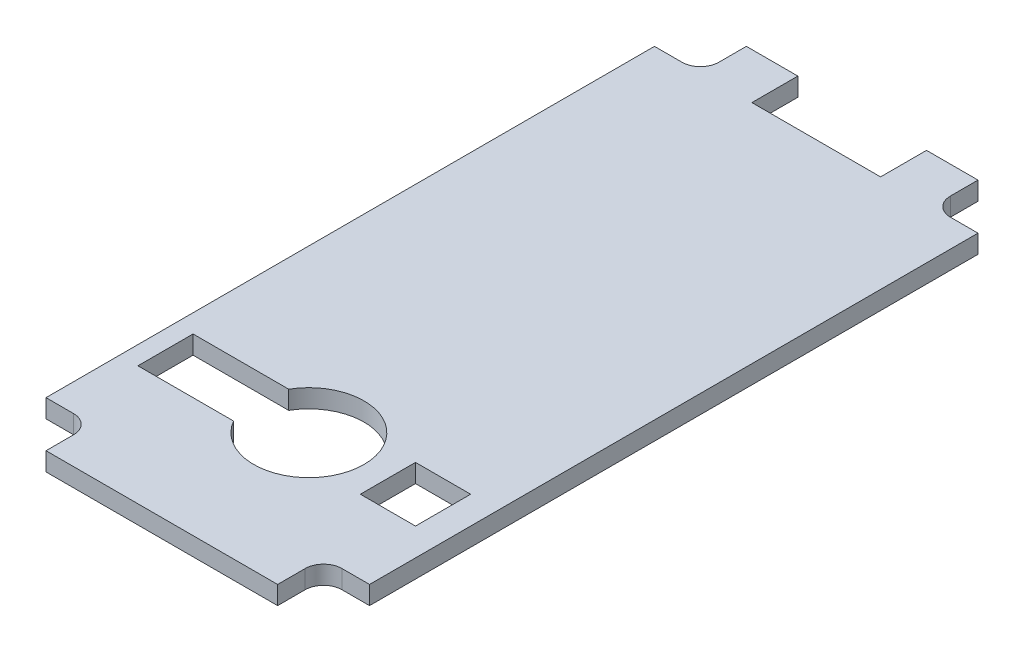
ISO-10303-21;
HEADER;
FILE_DESCRIPTION(('STEP AP214'),'2;1');
FILE_NAME('part.step','',(''),(''),'','','');
FILE_SCHEMA(('AUTOMOTIVE_DESIGN { 1 0 10303 214 1 1 1 1 }'));
ENDSEC;
DATA;
#1=APPLICATION_CONTEXT('core data for automotive mechanical design processes');
#2=APPLICATION_PROTOCOL_DEFINITION('international standard','automotive_design',2000,#1);
#3=PRODUCT_CONTEXT('',#1,'mechanical');
#4=PRODUCT('Part','Part','',(#3));
#5=PRODUCT_RELATED_PRODUCT_CATEGORY('part','',(#4));
#6=PRODUCT_DEFINITION_FORMATION('','',#4);
#7=PRODUCT_DEFINITION_CONTEXT('part definition',#1,'design');
#8=PRODUCT_DEFINITION('design','',#6,#7);
#9=PRODUCT_DEFINITION_SHAPE('','',#8);
#10=(LENGTH_UNIT() NAMED_UNIT(*) SI_UNIT(.MILLI.,.METRE.));
#11=(NAMED_UNIT(*) PLANE_ANGLE_UNIT() SI_UNIT($,.RADIAN.));
#12=(NAMED_UNIT(*) SI_UNIT($,.STERADIAN.) SOLID_ANGLE_UNIT());
#13=UNCERTAINTY_MEASURE_WITH_UNIT(LENGTH_MEASURE(1.E-05),#10,'distance_accuracy_value','');
#14=(GEOMETRIC_REPRESENTATION_CONTEXT(3) GLOBAL_UNCERTAINTY_ASSIGNED_CONTEXT((#13)) GLOBAL_UNIT_ASSIGNED_CONTEXT((#10,
#11,#12)) REPRESENTATION_CONTEXT('',''));
#15=CARTESIAN_POINT('',(0.,0.,0.));
#16=DIRECTION('',(0.,0.,1.));
#17=DIRECTION('',(1.,0.,0.));
#18=AXIS2_PLACEMENT_3D('',#15,#16,#17);
#19=CARTESIAN_POINT('',(-8.8,1.,-19.05));
#20=DIRECTION('',(0.,0.,1.));
#21=DIRECTION('',(1.,0.,0.));
#22=AXIS2_PLACEMENT_3D('',#19,#20,#21);
#23=PLANE('',#22);
#24=DIRECTION('',(-1.,0.,0.));
#25=VECTOR('',#24,1.);
#26=CARTESIAN_POINT('',(-8.8,1.,-19.05));
#27=LINE('',#26,#25);
#28=CARTESIAN_POINT('',(6.3,1.,-19.05));
#29=VERTEX_POINT('',#28);
#30=CARTESIAN_POINT('',(3.5,1.,-19.05));
#31=VERTEX_POINT('',#30);
#32=EDGE_CURVE('E413',#29,#31,#27,.T.);
#33=ORIENTED_EDGE('',*,*,#32,.F.);
#34=DIRECTION('',(0.,1.,0.));
#35=VECTOR('',#34,1.);
#36=CARTESIAN_POINT('',(6.3,-0.000999999999999916,-19.05));
#37=LINE('',#36,#35);
#38=CARTESIAN_POINT('',(6.3,0.,-19.05));
#39=VERTEX_POINT('',#38);
#40=EDGE_CURVE('E375',#39,#29,#37,.T.);
#41=ORIENTED_EDGE('',*,*,#40,.F.);
#42=DIRECTION('',(-1.,0.,0.));
#43=VECTOR('',#42,1.);
#44=CARTESIAN_POINT('',(-8.8,0.,-19.05));
#45=LINE('',#44,#43);
#46=CARTESIAN_POINT('',(3.5,0.,-19.05));
#47=VERTEX_POINT('',#46);
#48=EDGE_CURVE('E419',#39,#47,#45,.T.);
#49=ORIENTED_EDGE('',*,*,#48,.T.);
#50=DIRECTION('',(0.,1.,0.));
#51=VECTOR('',#50,1.);
#52=CARTESIAN_POINT('',(3.5,-0.000999999999999916,-19.05));
#53=LINE('',#52,#51);
#54=EDGE_CURVE('E400',#47,#31,#53,.T.);
#55=ORIENTED_EDGE('',*,*,#54,.T.);
#56=EDGE_LOOP('',(#33,#41,#49,#55));
#57=FACE_BOUND('',#56,.T.);
#58=ADVANCED_FACE('F33',(#57),#23,.F.);
#59=CARTESIAN_POINT('',(8.8,1.,-19.05));
#60=DIRECTION('',(-1.,0.,0.));
#61=DIRECTION('',(0.,0.,1.));
#62=AXIS2_PLACEMENT_3D('',#59,#60,#61);
#63=PLANE('',#62);
#64=DIRECTION('',(0.,0.,-1.));
#65=VECTOR('',#64,1.);
#66=CARTESIAN_POINT('',(8.8,1.,-19.05));
#67=LINE('',#66,#65);
#68=CARTESIAN_POINT('',(8.8,1.,16.55));
#69=VERTEX_POINT('',#68);
#70=CARTESIAN_POINT('',(8.8,1.,-16.55));
#71=VERTEX_POINT('',#70);
#72=EDGE_CURVE('E410',#69,#71,#67,.T.);
#73=ORIENTED_EDGE('',*,*,#72,.F.);
#74=DIRECTION('',(0.,1.,0.));
#75=VECTOR('',#74,1.);
#76=CARTESIAN_POINT('',(8.8,-0.000999999999999916,16.55));
#77=LINE('',#76,#75);
#78=CARTESIAN_POINT('',(8.8,0.,16.55));
#79=VERTEX_POINT('',#78);
#80=EDGE_CURVE('E326',#79,#69,#77,.T.);
#81=ORIENTED_EDGE('',*,*,#80,.F.);
#82=DIRECTION('',(0.,0.,-1.));
#83=VECTOR('',#82,1.);
#84=CARTESIAN_POINT('',(8.8,0.,-19.05));
#85=LINE('',#84,#83);
#86=CARTESIAN_POINT('',(8.8,0.,-16.55));
#87=VERTEX_POINT('',#86);
#88=EDGE_CURVE('E403',#79,#87,#85,.T.);
#89=ORIENTED_EDGE('',*,*,#88,.T.);
#90=DIRECTION('',(0.,1.,0.));
#91=VECTOR('',#90,1.);
#92=CARTESIAN_POINT('',(8.8,-0.000999999999999916,-16.55));
#93=LINE('',#92,#91);
#94=EDGE_CURVE('E376',#87,#71,#93,.T.);
#95=ORIENTED_EDGE('',*,*,#94,.T.);
#96=EDGE_LOOP('',(#73,#81,#89,#95));
#97=FACE_BOUND('',#96,.T.);
#98=ADVANCED_FACE('F35',(#97),#63,.F.);
#99=CARTESIAN_POINT('',(-3.5,0.,-19.05));
#100=VERTEX_POINT('',#99);
#101=CARTESIAN_POINT('',(-6.3,0.,-19.05));
#102=VERTEX_POINT('',#101);
#103=EDGE_CURVE('E418',#100,#102,#45,.T.);
#104=ORIENTED_EDGE('',*,*,#103,.T.);
#105=DIRECTION('',(0.,1.,0.));
#106=VECTOR('',#105,1.);
#107=CARTESIAN_POINT('',(-6.3,-0.000999999999999916,-19.05));
#108=LINE('',#107,#106);
#109=CARTESIAN_POINT('',(-6.3,1.,-19.05));
#110=VERTEX_POINT('',#109);
#111=EDGE_CURVE('E349',#102,#110,#108,.T.);
#112=ORIENTED_EDGE('',*,*,#111,.T.);
#113=CARTESIAN_POINT('',(-3.5,1.,-19.05));
#114=VERTEX_POINT('',#113);
#115=EDGE_CURVE('E412',#114,#110,#27,.T.);
#116=ORIENTED_EDGE('',*,*,#115,.F.);
#117=DIRECTION('',(0.,1.,0.));
#118=VECTOR('',#117,1.);
#119=CARTESIAN_POINT('',(-3.5,-0.000999999999999916,-19.05));
#120=LINE('',#119,#118);
#121=EDGE_CURVE('E406',#100,#114,#120,.T.);
#122=ORIENTED_EDGE('',*,*,#121,.F.);
#123=EDGE_LOOP('',(#104,#112,#116,#122));
#124=FACE_BOUND('',#123,.T.);
#125=ADVANCED_FACE('F483',(#124),#23,.F.);
#126=CARTESIAN_POINT('',(-8.8,1.,-19.05));
#127=DIRECTION('',(1.,0.,0.));
#128=DIRECTION('',(0.,0.,-1.));
#129=AXIS2_PLACEMENT_3D('',#126,#127,#128);
#130=PLANE('',#129);
#131=DIRECTION('',(0.,0.,1.));
#132=VECTOR('',#131,1.);
#133=CARTESIAN_POINT('',(-8.8,0.,-19.05));
#134=LINE('',#133,#132);
#135=CARTESIAN_POINT('',(-8.8,0.,-16.55));
#136=VERTEX_POINT('',#135);
#137=CARTESIAN_POINT('',(-8.8,0.,16.55));
#138=VERTEX_POINT('',#137);
#139=EDGE_CURVE('E420',#136,#138,#134,.T.);
#140=ORIENTED_EDGE('',*,*,#139,.T.);
#141=DIRECTION('',(0.,1.,0.));
#142=VECTOR('',#141,1.);
#143=CARTESIAN_POINT('',(-8.8,-0.000999999999999916,16.55));
#144=LINE('',#143,#142);
#145=CARTESIAN_POINT('',(-8.8,1.,16.55));
#146=VERTEX_POINT('',#145);
#147=EDGE_CURVE('E302',#138,#146,#144,.T.);
#148=ORIENTED_EDGE('',*,*,#147,.T.);
#149=DIRECTION('',(0.,0.,1.));
#150=VECTOR('',#149,1.);
#151=CARTESIAN_POINT('',(-8.8,1.,-19.05));
#152=LINE('',#151,#150);
#153=CARTESIAN_POINT('',(-8.8,1.,-16.55));
#154=VERTEX_POINT('',#153);
#155=EDGE_CURVE('E42',#154,#146,#152,.T.);
#156=ORIENTED_EDGE('',*,*,#155,.F.);
#157=DIRECTION('',(0.,1.,0.));
#158=VECTOR('',#157,1.);
#159=CARTESIAN_POINT('',(-8.8,-0.000999999999999916,-16.55));
#160=LINE('',#159,#158);
#161=EDGE_CURVE('E348',#136,#154,#160,.T.);
#162=ORIENTED_EDGE('',*,*,#161,.F.);
#163=EDGE_LOOP('',(#140,#148,#156,#162));
#164=FACE_BOUND('',#163,.T.);
#165=ADVANCED_FACE('F464',(#164),#130,.F.);
#166=CARTESIAN_POINT('',(-8.8,1.,19.05));
#167=DIRECTION('',(0.,0.,-1.));
#168=DIRECTION('',(-1.,0.,0.));
#169=AXIS2_PLACEMENT_3D('',#166,#167,#168);
#170=PLANE('',#169);
#171=DIRECTION('',(1.,0.,0.));
#172=VECTOR('',#171,1.);
#173=CARTESIAN_POINT('',(-8.8,1.,19.05));
#174=LINE('',#173,#172);
#175=CARTESIAN_POINT('',(-6.3,1.,19.05));
#176=VERTEX_POINT('',#175);
#177=CARTESIAN_POINT('',(6.30000000000001,1.,19.05));
#178=VERTEX_POINT('',#177);
#179=EDGE_CURVE('E11',#176,#178,#174,.T.);
#180=ORIENTED_EDGE('',*,*,#179,.F.);
#181=DIRECTION('',(0.,1.,0.));
#182=VECTOR('',#181,1.);
#183=CARTESIAN_POINT('',(-6.3,-0.000999999999999916,19.05));
#184=LINE('',#183,#182);
#185=CARTESIAN_POINT('',(-6.3,0.,19.05));
#186=VERTEX_POINT('',#185);
#187=EDGE_CURVE('E301',#186,#176,#184,.T.);
#188=ORIENTED_EDGE('',*,*,#187,.F.);
#189=DIRECTION('',(1.,0.,0.));
#190=VECTOR('',#189,1.);
#191=CARTESIAN_POINT('',(-8.8,0.,19.05));
#192=LINE('',#191,#190);
#193=CARTESIAN_POINT('',(6.30000000000001,0.,19.05));
#194=VERTEX_POINT('',#193);
#195=EDGE_CURVE('E37',#186,#194,#192,.T.);
#196=ORIENTED_EDGE('',*,*,#195,.T.);
#197=DIRECTION('',(0.,1.,0.));
#198=VECTOR('',#197,1.);
#199=CARTESIAN_POINT('',(6.30000000000001,-0.000999999999999916,19.05));
#200=LINE('',#199,#198);
#201=EDGE_CURVE('E327',#194,#178,#200,.T.);
#202=ORIENTED_EDGE('',*,*,#201,.T.);
#203=EDGE_LOOP('',(#180,#188,#196,#202));
#204=FACE_BOUND('',#203,.T.);
#205=ADVANCED_FACE('F430',(#204),#170,.F.);
#206=CARTESIAN_POINT('',(8.8,1.,19.05));
#207=DIRECTION('',(0.,1.,0.));
#208=DIRECTION('',(0.,0.,1.));
#209=AXIS2_PLACEMENT_3D('',#206,#207,#208);
#210=PLANE('',#209);
#211=DIRECTION('',(0.,0.,1.));
#212=VECTOR('',#211,1.);
#213=CARTESIAN_POINT('',(4.3,1.,9.54999999999999));
#214=LINE('',#213,#212);
#215=CARTESIAN_POINT('',(4.3,1.,9.54999999999999));
#216=VERTEX_POINT('',#215);
#217=CARTESIAN_POINT('',(4.3,1.,12.55));
#218=VERTEX_POINT('',#217);
#219=EDGE_CURVE('E50',#216,#218,#214,.T.);
#220=ORIENTED_EDGE('',*,*,#219,.F.);
#221=DIRECTION('',(-1.,0.,0.));
#222=VECTOR('',#221,1.);
#223=CARTESIAN_POINT('',(4.3,1.,9.54999999999999));
#224=LINE('',#223,#222);
#225=CARTESIAN_POINT('',(7.3,1.,9.54999999999999));
#226=VERTEX_POINT('',#225);
#227=EDGE_CURVE('E227',#226,#216,#224,.T.);
#228=ORIENTED_EDGE('',*,*,#227,.F.);
#229=DIRECTION('',(0.,0.,-1.));
#230=VECTOR('',#229,1.);
#231=CARTESIAN_POINT('',(7.3,1.,9.54999999999999));
#232=LINE('',#231,#230);
#233=CARTESIAN_POINT('',(7.3,1.,12.55));
#234=VERTEX_POINT('',#233);
#235=EDGE_CURVE('E247',#234,#226,#232,.T.);
#236=ORIENTED_EDGE('',*,*,#235,.F.);
#237=DIRECTION('',(1.,0.,0.));
#238=VECTOR('',#237,1.);
#239=CARTESIAN_POINT('',(4.3,1.,12.55));
#240=LINE('',#239,#238);
#241=EDGE_CURVE('E241',#218,#234,#240,.T.);
#242=ORIENTED_EDGE('',*,*,#241,.F.);
#243=EDGE_LOOP('',(#220,#228,#236,#242));
#244=FACE_BOUND('',#243,.T.);
#245=CARTESIAN_POINT('',(0.,1.,11.05));
#246=DIRECTION('',(0.,1.,0.));
#247=DIRECTION('',(0.,0.,1.));
#248=AXIS2_PLACEMENT_3D('',#245,#246,#247);
#249=CIRCLE('',#248,3.);
#250=CARTESIAN_POINT('',(-2.59807621135332,1.,12.55));
#251=VERTEX_POINT('',#250);
#252=CARTESIAN_POINT('',(-2.59807621135331,1.,9.55));
#253=VERTEX_POINT('',#252);
#254=EDGE_CURVE('E263',#251,#253,#249,.T.);
#255=ORIENTED_EDGE('',*,*,#254,.F.);
#256=DIRECTION('',(1.,0.,0.));
#257=VECTOR('',#256,1.);
#258=CARTESIAN_POINT('',(-7.8,1.,12.55));
#259=LINE('',#258,#257);
#260=CARTESIAN_POINT('',(-7.8,1.,12.55));
#261=VERTEX_POINT('',#260);
#262=EDGE_CURVE('E271',#261,#251,#259,.T.);
#263=ORIENTED_EDGE('',*,*,#262,.F.);
#264=DIRECTION('',(0.,0.,1.));
#265=VECTOR('',#264,1.);
#266=CARTESIAN_POINT('',(-7.8,1.,9.54999999999999));
#267=LINE('',#266,#265);
#268=CARTESIAN_POINT('',(-7.8,1.,9.54999999999999));
#269=VERTEX_POINT('',#268);
#270=EDGE_CURVE('E268',#269,#261,#267,.T.);
#271=ORIENTED_EDGE('',*,*,#270,.F.);
#272=DIRECTION('',(-1.,0.,0.));
#273=VECTOR('',#272,1.);
#274=CARTESIAN_POINT('',(-7.8,1.,9.54999999999999));
#275=LINE('',#274,#273);
#276=EDGE_CURVE('E265',#253,#269,#275,.T.);
#277=ORIENTED_EDGE('',*,*,#276,.F.);
#278=EDGE_LOOP('',(#255,#263,#271,#277));
#279=FACE_BOUND('',#278,.T.);
#280=DIRECTION('',(-1.,0.,0.));
#281=VECTOR('',#280,1.);
#282=CARTESIAN_POINT('',(-8.8,1.,16.55));
#283=LINE('',#282,#281);
#284=CARTESIAN_POINT('',(-7.3,1.,16.55));
#285=VERTEX_POINT('',#284);
#286=EDGE_CURVE('E299',#285,#146,#283,.T.);
#287=ORIENTED_EDGE('',*,*,#286,.F.);
#288=CARTESIAN_POINT('',(-7.3,1.,17.55));
#289=DIRECTION('',(0.,1.,0.));
#290=DIRECTION('',(0.,0.,-1.));
#291=AXIS2_PLACEMENT_3D('',#288,#289,#290);
#292=CIRCLE('',#291,1.);
#293=CARTESIAN_POINT('',(-6.3,1.,17.55));
#294=VERTEX_POINT('',#293);
#295=EDGE_CURVE('E296',#294,#285,#292,.T.);
#296=ORIENTED_EDGE('',*,*,#295,.F.);
#297=DIRECTION('',(0.,0.,-1.));
#298=VECTOR('',#297,1.);
#299=CARTESIAN_POINT('',(-6.3,1.,19.05));
#300=LINE('',#299,#298);
#301=EDGE_CURVE('E293',#176,#294,#300,.T.);
#302=ORIENTED_EDGE('',*,*,#301,.F.);
#303=ORIENTED_EDGE('',*,*,#179,.T.);
#304=DIRECTION('',(0.,0.,1.));
#305=VECTOR('',#304,1.);
#306=CARTESIAN_POINT('',(6.30000000000001,1.,17.55));
#307=LINE('',#306,#305);
#308=CARTESIAN_POINT('',(6.30000000000001,1.,17.55));
#309=VERTEX_POINT('',#308);
#310=EDGE_CURVE('E323',#309,#178,#307,.T.);
#311=ORIENTED_EDGE('',*,*,#310,.F.);
#312=CARTESIAN_POINT('',(7.30000000000001,1.,17.55));
#313=DIRECTION('',(0.,1.,0.));
#314=DIRECTION('',(0.,0.,1.));
#315=AXIS2_PLACEMENT_3D('',#312,#313,#314);
#316=CIRCLE('',#315,1.);
#317=CARTESIAN_POINT('',(7.30000000000002,1.,16.55));
#318=VERTEX_POINT('',#317);
#319=EDGE_CURVE('E320',#318,#309,#316,.T.);
#320=ORIENTED_EDGE('',*,*,#319,.F.);
#321=DIRECTION('',(-1.,0.,0.));
#322=VECTOR('',#321,1.);
#323=CARTESIAN_POINT('',(7.30000000000002,1.,16.55));
#324=LINE('',#323,#322);
#325=EDGE_CURVE('E317',#69,#318,#324,.T.);
#326=ORIENTED_EDGE('',*,*,#325,.F.);
#327=ORIENTED_EDGE('',*,*,#72,.T.);
#328=DIRECTION('',(1.,0.,0.));
#329=VECTOR('',#328,1.);
#330=CARTESIAN_POINT('',(8.8,1.,-16.55));
#331=LINE('',#330,#329);
#332=CARTESIAN_POINT('',(7.30000000000001,1.,-16.55));
#333=VERTEX_POINT('',#332);
#334=EDGE_CURVE('E372',#333,#71,#331,.T.);
#335=ORIENTED_EDGE('',*,*,#334,.F.);
#336=CARTESIAN_POINT('',(7.3,1.,-17.55));
#337=DIRECTION('',(0.,1.,0.));
#338=DIRECTION('',(0.,0.,-1.));
#339=AXIS2_PLACEMENT_3D('',#336,#337,#338);
#340=CIRCLE('',#339,1.);
#341=CARTESIAN_POINT('',(6.3,1.,-17.55));
#342=VERTEX_POINT('',#341);
#343=EDGE_CURVE('E369',#342,#333,#340,.T.);
#344=ORIENTED_EDGE('',*,*,#343,.F.);
#345=DIRECTION('',(0.,0.,1.));
#346=VECTOR('',#345,1.);
#347=CARTESIAN_POINT('',(6.3,1.,-19.05));
#348=LINE('',#347,#346);
#349=EDGE_CURVE('E366',#29,#342,#348,.T.);
#350=ORIENTED_EDGE('',*,*,#349,.F.);
#351=ORIENTED_EDGE('',*,*,#32,.T.);
#352=DIRECTION('',(0.,0.,-1.));
#353=VECTOR('',#352,1.);
#354=CARTESIAN_POINT('',(3.5,1.,-16.55));
#355=LINE('',#354,#353);
#356=CARTESIAN_POINT('',(3.5,1.,-16.55));
#357=VERTEX_POINT('',#356);
#358=EDGE_CURVE('E391',#357,#31,#355,.T.);
#359=ORIENTED_EDGE('',*,*,#358,.F.);
#360=DIRECTION('',(1.,0.,0.));
#361=VECTOR('',#360,1.);
#362=CARTESIAN_POINT('',(-3.5,1.,-16.55));
#363=LINE('',#362,#361);
#364=CARTESIAN_POINT('',(-3.5,1.,-16.55));
#365=VERTEX_POINT('',#364);
#366=EDGE_CURVE('E397',#365,#357,#363,.T.);
#367=ORIENTED_EDGE('',*,*,#366,.F.);
#368=DIRECTION('',(0.,0.,1.));
#369=VECTOR('',#368,1.);
#370=CARTESIAN_POINT('',(-3.5,1.,-16.55));
#371=LINE('',#370,#369);
#372=EDGE_CURVE('E394',#114,#365,#371,.T.);
#373=ORIENTED_EDGE('',*,*,#372,.F.);
#374=ORIENTED_EDGE('',*,*,#115,.T.);
#375=DIRECTION('',(0.,0.,-1.));
#376=VECTOR('',#375,1.);
#377=CARTESIAN_POINT('',(-6.3,1.,-19.05));
#378=LINE('',#377,#376);
#379=CARTESIAN_POINT('',(-6.3,1.,-17.55));
#380=VERTEX_POINT('',#379);
#381=EDGE_CURVE('E346',#380,#110,#378,.T.);
#382=ORIENTED_EDGE('',*,*,#381,.F.);
#383=CARTESIAN_POINT('',(-7.3,1.,-17.55));
#384=DIRECTION('',(0.,1.,0.));
#385=DIRECTION('',(0.,0.,1.));
#386=AXIS2_PLACEMENT_3D('',#383,#384,#385);
#387=CIRCLE('',#386,1.);
#388=CARTESIAN_POINT('',(-7.30000000000001,1.,-16.55));
#389=VERTEX_POINT('',#388);
#390=EDGE_CURVE('E343',#389,#380,#387,.T.);
#391=ORIENTED_EDGE('',*,*,#390,.F.);
#392=DIRECTION('',(1.,0.,0.));
#393=VECTOR('',#392,1.);
#394=CARTESIAN_POINT('',(-8.8,1.,-16.55));
#395=LINE('',#394,#393);
#396=EDGE_CURVE('E340',#154,#389,#395,.T.);
#397=ORIENTED_EDGE('',*,*,#396,.F.);
#398=ORIENTED_EDGE('',*,*,#155,.T.);
#399=EDGE_LOOP('',(#287,#296,#302,#303,#311,#320,#326,#327,#335,#344,#350,#351,#359,#367,#373,
#374,#382,#391,#397,#398));
#400=FACE_BOUND('',#399,.T.);
#401=ADVANCED_FACE('F452',(#244,#279,#400),#210,.T.);
#402=CARTESIAN_POINT('',(8.8,0.,19.05));
#403=DIRECTION('',(0.,1.,0.));
#404=DIRECTION('',(0.,0.,1.));
#405=AXIS2_PLACEMENT_3D('',#402,#403,#404);
#406=PLANE('',#405);
#407=DIRECTION('',(1.,0.,0.));
#408=VECTOR('',#407,1.);
#409=CARTESIAN_POINT('',(4.3,0.,9.54999999999999));
#410=LINE('',#409,#408);
#411=CARTESIAN_POINT('',(4.3,0.,9.54999999999999));
#412=VERTEX_POINT('',#411);
#413=CARTESIAN_POINT('',(7.3,0.,9.54999999999999));
#414=VERTEX_POINT('',#413);
#415=EDGE_CURVE('E239',#412,#414,#410,.T.);
#416=ORIENTED_EDGE('',*,*,#415,.F.);
#417=DIRECTION('',(0.,0.,-1.));
#418=VECTOR('',#417,1.);
#419=CARTESIAN_POINT('',(4.3,0.,9.54999999999999));
#420=LINE('',#419,#418);
#421=CARTESIAN_POINT('',(4.3,0.,12.55));
#422=VERTEX_POINT('',#421);
#423=EDGE_CURVE('E221',#422,#412,#420,.T.);
#424=ORIENTED_EDGE('',*,*,#423,.F.);
#425=DIRECTION('',(-1.,0.,0.));
#426=VECTOR('',#425,1.);
#427=CARTESIAN_POINT('',(4.3,0.,12.55));
#428=LINE('',#427,#426);
#429=CARTESIAN_POINT('',(7.3,0.,12.55));
#430=VERTEX_POINT('',#429);
#431=EDGE_CURVE('E230',#430,#422,#428,.T.);
#432=ORIENTED_EDGE('',*,*,#431,.F.);
#433=DIRECTION('',(0.,0.,1.));
#434=VECTOR('',#433,1.);
#435=CARTESIAN_POINT('',(7.3,0.,9.54999999999999));
#436=LINE('',#435,#434);
#437=EDGE_CURVE('E58',#414,#430,#436,.T.);
#438=ORIENTED_EDGE('',*,*,#437,.F.);
#439=EDGE_LOOP('',(#416,#424,#432,#438));
#440=FACE_BOUND('',#439,.T.);
#441=DIRECTION('',(-1.,0.,0.));
#442=VECTOR('',#441,1.);
#443=CARTESIAN_POINT('',(-7.8,0.,12.55));
#444=LINE('',#443,#442);
#445=CARTESIAN_POINT('',(-2.59807621135332,0.,12.55));
#446=VERTEX_POINT('',#445);
#447=CARTESIAN_POINT('',(-7.8,0.,12.55));
#448=VERTEX_POINT('',#447);
#449=EDGE_CURVE('E257',#446,#448,#444,.T.);
#450=ORIENTED_EDGE('',*,*,#449,.F.);
#451=CARTESIAN_POINT('',(0.,0.,11.05));
#452=DIRECTION('',(0.,1.,0.));
#453=DIRECTION('',(0.,0.,1.));
#454=AXIS2_PLACEMENT_3D('',#451,#452,#453);
#455=CIRCLE('',#454,3.);
#456=CARTESIAN_POINT('',(-2.59807621135331,0.,9.55));
#457=VERTEX_POINT('',#456);
#458=EDGE_CURVE('E260',#457,#446,#455,.F.);
#459=ORIENTED_EDGE('',*,*,#458,.F.);
#460=DIRECTION('',(1.,0.,0.));
#461=VECTOR('',#460,1.);
#462=CARTESIAN_POINT('',(-7.8,0.,9.54999999999999));
#463=LINE('',#462,#461);
#464=CARTESIAN_POINT('',(-7.8,0.,9.54999999999999));
#465=VERTEX_POINT('',#464);
#466=EDGE_CURVE('E277',#465,#457,#463,.T.);
#467=ORIENTED_EDGE('',*,*,#466,.F.);
#468=DIRECTION('',(0.,0.,-1.));
#469=VECTOR('',#468,1.);
#470=CARTESIAN_POINT('',(-7.8,0.,9.54999999999999));
#471=LINE('',#470,#469);
#472=EDGE_CURVE('E233',#448,#465,#471,.T.);
#473=ORIENTED_EDGE('',*,*,#472,.F.);
#474=EDGE_LOOP('',(#450,#459,#467,#473));
#475=FACE_BOUND('',#474,.T.);
#476=CARTESIAN_POINT('',(-7.3,0.,17.55));
#477=DIRECTION('',(0.,1.,0.));
#478=DIRECTION('',(0.,0.,1.));
#479=AXIS2_PLACEMENT_3D('',#476,#477,#478);
#480=CIRCLE('',#479,1.);
#481=CARTESIAN_POINT('',(-7.3,0.,16.55));
#482=VERTEX_POINT('',#481);
#483=CARTESIAN_POINT('',(-6.3,0.,17.55));
#484=VERTEX_POINT('',#483);
#485=EDGE_CURVE('E288',#482,#484,#480,.F.);
#486=ORIENTED_EDGE('',*,*,#485,.F.);
#487=DIRECTION('',(1.,0.,0.));
#488=VECTOR('',#487,1.);
#489=CARTESIAN_POINT('',(-8.8,0.,16.55));
#490=LINE('',#489,#488);
#491=EDGE_CURVE('E290',#138,#482,#490,.T.);
#492=ORIENTED_EDGE('',*,*,#491,.F.);
#493=ORIENTED_EDGE('',*,*,#139,.F.);
#494=DIRECTION('',(-1.,0.,0.));
#495=VECTOR('',#494,1.);
#496=CARTESIAN_POINT('',(-8.8,0.,-16.55));
#497=LINE('',#496,#495);
#498=CARTESIAN_POINT('',(-7.30000000000001,0.,-16.55));
#499=VERTEX_POINT('',#498);
#500=EDGE_CURVE('E352',#499,#136,#497,.T.);
#501=ORIENTED_EDGE('',*,*,#500,.F.);
#502=CARTESIAN_POINT('',(-7.3,0.,-17.55));
#503=DIRECTION('',(0.,1.,0.));
#504=DIRECTION('',(0.,0.,1.));
#505=AXIS2_PLACEMENT_3D('',#502,#503,#504);
#506=CIRCLE('',#505,1.);
#507=CARTESIAN_POINT('',(-6.3,0.,-17.55));
#508=VERTEX_POINT('',#507);
#509=EDGE_CURVE('E330',#508,#499,#506,.F.);
#510=ORIENTED_EDGE('',*,*,#509,.F.);
#511=DIRECTION('',(0.,0.,1.));
#512=VECTOR('',#511,1.);
#513=CARTESIAN_POINT('',(-6.3,0.,-19.05));
#514=LINE('',#513,#512);
#515=EDGE_CURVE('E337',#102,#508,#514,.T.);
#516=ORIENTED_EDGE('',*,*,#515,.F.);
#517=ORIENTED_EDGE('',*,*,#103,.F.);
#518=DIRECTION('',(0.,0.,-1.));
#519=VECTOR('',#518,1.);
#520=CARTESIAN_POINT('',(-3.5,0.,-16.55));
#521=LINE('',#520,#519);
#522=CARTESIAN_POINT('',(-3.5,0.,-16.55));
#523=VERTEX_POINT('',#522);
#524=EDGE_CURVE('E379',#523,#100,#521,.T.);
#525=ORIENTED_EDGE('',*,*,#524,.F.);
#526=DIRECTION('',(-1.,0.,0.));
#527=VECTOR('',#526,1.);
#528=CARTESIAN_POINT('',(-3.5,0.,-16.55));
#529=LINE('',#528,#527);
#530=CARTESIAN_POINT('',(3.5,0.,-16.55));
#531=VERTEX_POINT('',#530);
#532=EDGE_CURVE('E386',#531,#523,#529,.T.);
#533=ORIENTED_EDGE('',*,*,#532,.F.);
#534=DIRECTION('',(0.,0.,1.));
#535=VECTOR('',#534,1.);
#536=CARTESIAN_POINT('',(3.5,0.,-16.55));
#537=LINE('',#536,#535);
#538=EDGE_CURVE('E388',#47,#531,#537,.T.);
#539=ORIENTED_EDGE('',*,*,#538,.F.);
#540=ORIENTED_EDGE('',*,*,#48,.F.);
#541=DIRECTION('',(0.,0.,-1.));
#542=VECTOR('',#541,1.);
#543=CARTESIAN_POINT('',(6.3,0.,-19.05));
#544=LINE('',#543,#542);
#545=CARTESIAN_POINT('',(6.3,0.,-17.55));
#546=VERTEX_POINT('',#545);
#547=EDGE_CURVE('E359',#546,#39,#544,.T.);
#548=ORIENTED_EDGE('',*,*,#547,.F.);
#549=CARTESIAN_POINT('',(7.3,0.,-17.55));
#550=DIRECTION('',(0.,1.,0.));
#551=DIRECTION('',(0.,0.,1.));
#552=AXIS2_PLACEMENT_3D('',#549,#550,#551);
#553=CIRCLE('',#552,1.);
#554=CARTESIAN_POINT('',(7.30000000000001,0.,-16.55));
#555=VERTEX_POINT('',#554);
#556=EDGE_CURVE('E361',#555,#546,#553,.F.);
#557=ORIENTED_EDGE('',*,*,#556,.F.);
#558=DIRECTION('',(-1.,0.,0.));
#559=VECTOR('',#558,1.);
#560=CARTESIAN_POINT('',(8.8,0.,-16.55));
#561=LINE('',#560,#559);
#562=EDGE_CURVE('E363',#87,#555,#561,.T.);
#563=ORIENTED_EDGE('',*,*,#562,.F.);
#564=ORIENTED_EDGE('',*,*,#88,.F.);
#565=DIRECTION('',(1.,0.,0.));
#566=VECTOR('',#565,1.);
#567=CARTESIAN_POINT('',(7.30000000000002,0.,16.55));
#568=LINE('',#567,#566);
#569=CARTESIAN_POINT('',(7.30000000000002,0.,16.55));
#570=VERTEX_POINT('',#569);
#571=EDGE_CURVE('E305',#570,#79,#568,.T.);
#572=ORIENTED_EDGE('',*,*,#571,.F.);
#573=CARTESIAN_POINT('',(7.30000000000001,0.,17.55));
#574=DIRECTION('',(0.,1.,0.));
#575=DIRECTION('',(0.,0.,1.));
#576=AXIS2_PLACEMENT_3D('',#573,#574,#575);
#577=CIRCLE('',#576,1.);
#578=CARTESIAN_POINT('',(6.30000000000001,0.,17.55));
#579=VERTEX_POINT('',#578);
#580=EDGE_CURVE('E312',#579,#570,#577,.F.);
#581=ORIENTED_EDGE('',*,*,#580,.F.);
#582=DIRECTION('',(0.,0.,-1.));
#583=VECTOR('',#582,1.);
#584=CARTESIAN_POINT('',(6.30000000000001,0.,17.55));
#585=LINE('',#584,#583);
#586=EDGE_CURVE('E314',#194,#579,#585,.T.);
#587=ORIENTED_EDGE('',*,*,#586,.F.);
#588=ORIENTED_EDGE('',*,*,#195,.F.);
#589=DIRECTION('',(0.,0.,1.));
#590=VECTOR('',#589,1.);
#591=CARTESIAN_POINT('',(-6.3,0.,19.05));
#592=LINE('',#591,#590);
#593=EDGE_CURVE('E286',#484,#186,#592,.T.);
#594=ORIENTED_EDGE('',*,*,#593,.F.);
#595=EDGE_LOOP('',(#486,#492,#493,#501,#510,#516,#517,#525,#533,#539,#540,#548,#557,#563,#564,
#572,#581,#587,#588,#594));
#596=FACE_BOUND('',#595,.T.);
#597=ADVANCED_FACE('F236',(#440,#475,#596),#406,.F.);
#598=CARTESIAN_POINT('',(3.5,-0.000999999999999916,-16.55));
#599=DIRECTION('',(1.,0.,0.));
#600=DIRECTION('',(0.,0.,-1.));
#601=AXIS2_PLACEMENT_3D('',#598,#599,#600);
#602=PLANE('',#601);
#603=ORIENTED_EDGE('',*,*,#538,.T.);
#604=DIRECTION('',(0.,1.,0.));
#605=VECTOR('',#604,1.);
#606=CARTESIAN_POINT('',(3.5,-0.000999999999999916,-16.55));
#607=LINE('',#606,#605);
#608=EDGE_CURVE('E401',#531,#357,#607,.T.);
#609=ORIENTED_EDGE('',*,*,#608,.T.);
#610=ORIENTED_EDGE('',*,*,#358,.T.);
#611=ORIENTED_EDGE('',*,*,#54,.F.);
#612=EDGE_LOOP('',(#603,#609,#610,#611));
#613=FACE_BOUND('',#612,.T.);
#614=ADVANCED_FACE('F499',(#613),#602,.F.);
#615=CARTESIAN_POINT('',(-3.5,-0.000999999999999916,-16.55));
#616=DIRECTION('',(0.,0.,1.));
#617=DIRECTION('',(1.,0.,0.));
#618=AXIS2_PLACEMENT_3D('',#615,#616,#617);
#619=PLANE('',#618);
#620=ORIENTED_EDGE('',*,*,#532,.T.);
#621=DIRECTION('',(0.,1.,0.));
#622=VECTOR('',#621,1.);
#623=CARTESIAN_POINT('',(-3.5,-0.000999999999999916,-16.55));
#624=LINE('',#623,#622);
#625=EDGE_CURVE('E404',#523,#365,#624,.T.);
#626=ORIENTED_EDGE('',*,*,#625,.T.);
#627=ORIENTED_EDGE('',*,*,#366,.T.);
#628=ORIENTED_EDGE('',*,*,#608,.F.);
#629=EDGE_LOOP('',(#620,#626,#627,#628));
#630=FACE_BOUND('',#629,.T.);
#631=ADVANCED_FACE('F496',(#630),#619,.F.);
#632=CARTESIAN_POINT('',(-3.5,-0.000999999999999916,-16.55));
#633=DIRECTION('',(-1.,0.,0.));
#634=DIRECTION('',(0.,0.,1.));
#635=AXIS2_PLACEMENT_3D('',#632,#633,#634);
#636=PLANE('',#635);
#637=ORIENTED_EDGE('',*,*,#524,.T.);
#638=ORIENTED_EDGE('',*,*,#121,.T.);
#639=ORIENTED_EDGE('',*,*,#372,.T.);
#640=ORIENTED_EDGE('',*,*,#625,.F.);
#641=EDGE_LOOP('',(#637,#638,#639,#640));
#642=FACE_BOUND('',#641,.T.);
#643=ADVANCED_FACE('F490',(#642),#636,.F.);
#644=CARTESIAN_POINT('',(8.8,-0.000999999999999916,-16.55));
#645=DIRECTION('',(0.,0.,1.));
#646=DIRECTION('',(1.,0.,0.));
#647=AXIS2_PLACEMENT_3D('',#644,#645,#646);
#648=PLANE('',#647);
#649=ORIENTED_EDGE('',*,*,#562,.T.);
#650=DIRECTION('',(0.,1.,0.));
#651=VECTOR('',#650,1.);
#652=CARTESIAN_POINT('',(7.30000000000001,-0.000999999999999916,-16.55));
#653=LINE('',#652,#651);
#654=EDGE_CURVE('E380',#555,#333,#653,.T.);
#655=ORIENTED_EDGE('',*,*,#654,.T.);
#656=ORIENTED_EDGE('',*,*,#334,.T.);
#657=ORIENTED_EDGE('',*,*,#94,.F.);
#658=EDGE_LOOP('',(#649,#655,#656,#657));
#659=FACE_BOUND('',#658,.T.);
#660=ADVANCED_FACE('F516',(#659),#648,.F.);
#661=CARTESIAN_POINT('',(7.3,-0.000999999999999916,-17.55));
#662=DIRECTION('',(0.,1.,0.));
#663=DIRECTION('',(0.,0.,1.));
#664=AXIS2_PLACEMENT_3D('',#661,#662,#663);
#665=CYLINDRICAL_SURFACE('',#664,1.);
#666=ORIENTED_EDGE('',*,*,#556,.T.);
#667=DIRECTION('',(0.,1.,0.));
#668=VECTOR('',#667,1.);
#669=CARTESIAN_POINT('',(6.3,-0.000999999999999916,-17.55));
#670=LINE('',#669,#668);
#671=EDGE_CURVE('E382',#546,#342,#670,.T.);
#672=ORIENTED_EDGE('',*,*,#671,.T.);
#673=ORIENTED_EDGE('',*,*,#343,.T.);
#674=ORIENTED_EDGE('',*,*,#654,.F.);
#675=EDGE_LOOP('',(#666,#672,#673,#674));
#676=FACE_BOUND('',#675,.T.);
#677=ADVANCED_FACE('F512',(#676),#665,.F.);
#678=CARTESIAN_POINT('',(6.3,-0.000999999999999916,-19.05));
#679=DIRECTION('',(-1.,0.,0.));
#680=DIRECTION('',(0.,0.,1.));
#681=AXIS2_PLACEMENT_3D('',#678,#679,#680);
#682=PLANE('',#681);
#683=ORIENTED_EDGE('',*,*,#547,.T.);
#684=ORIENTED_EDGE('',*,*,#40,.T.);
#685=ORIENTED_EDGE('',*,*,#349,.T.);
#686=ORIENTED_EDGE('',*,*,#671,.F.);
#687=EDGE_LOOP('',(#683,#684,#685,#686));
#688=FACE_BOUND('',#687,.T.);
#689=ADVANCED_FACE('F508',(#688),#682,.F.);
#690=CARTESIAN_POINT('',(-6.3,-0.000999999999999916,-19.05));
#691=DIRECTION('',(1.,0.,0.));
#692=DIRECTION('',(0.,0.,-1.));
#693=AXIS2_PLACEMENT_3D('',#690,#691,#692);
#694=PLANE('',#693);
#695=ORIENTED_EDGE('',*,*,#515,.T.);
#696=DIRECTION('',(0.,1.,0.));
#697=VECTOR('',#696,1.);
#698=CARTESIAN_POINT('',(-6.3,-0.000999999999999916,-17.55));
#699=LINE('',#698,#697);
#700=EDGE_CURVE('E353',#508,#380,#699,.T.);
#701=ORIENTED_EDGE('',*,*,#700,.T.);
#702=ORIENTED_EDGE('',*,*,#381,.T.);
#703=ORIENTED_EDGE('',*,*,#111,.F.);
#704=EDGE_LOOP('',(#695,#701,#702,#703));
#705=FACE_BOUND('',#704,.T.);
#706=ADVANCED_FACE('F479',(#705),#694,.F.);
#707=CARTESIAN_POINT('',(-7.3,-0.000999999999999916,-17.55));
#708=DIRECTION('',(0.,1.,0.));
#709=DIRECTION('',(0.,0.,1.));
#710=AXIS2_PLACEMENT_3D('',#707,#708,#709);
#711=CYLINDRICAL_SURFACE('',#710,1.);
#712=ORIENTED_EDGE('',*,*,#509,.T.);
#713=DIRECTION('',(0.,1.,0.));
#714=VECTOR('',#713,1.);
#715=CARTESIAN_POINT('',(-7.30000000000001,-0.000999999999999916,-16.55));
#716=LINE('',#715,#714);
#717=EDGE_CURVE('E355',#499,#389,#716,.T.);
#718=ORIENTED_EDGE('',*,*,#717,.T.);
#719=ORIENTED_EDGE('',*,*,#390,.T.);
#720=ORIENTED_EDGE('',*,*,#700,.F.);
#721=EDGE_LOOP('',(#712,#718,#719,#720));
#722=FACE_BOUND('',#721,.T.);
#723=ADVANCED_FACE('F477',(#722),#711,.F.);
#724=CARTESIAN_POINT('',(-8.8,-0.000999999999999916,-16.55));
#725=DIRECTION('',(0.,0.,1.));
#726=DIRECTION('',(1.,0.,0.));
#727=AXIS2_PLACEMENT_3D('',#724,#725,#726);
#728=PLANE('',#727);
#729=ORIENTED_EDGE('',*,*,#500,.T.);
#730=ORIENTED_EDGE('',*,*,#161,.T.);
#731=ORIENTED_EDGE('',*,*,#396,.T.);
#732=ORIENTED_EDGE('',*,*,#717,.F.);
#733=EDGE_LOOP('',(#729,#730,#731,#732));
#734=FACE_BOUND('',#733,.T.);
#735=ADVANCED_FACE('F470',(#734),#728,.F.);
#736=CARTESIAN_POINT('',(6.30000000000001,-0.000999999999999916,17.55));
#737=DIRECTION('',(-1.,0.,0.));
#738=DIRECTION('',(0.,0.,1.));
#739=AXIS2_PLACEMENT_3D('',#736,#737,#738);
#740=PLANE('',#739);
#741=ORIENTED_EDGE('',*,*,#586,.T.);
#742=DIRECTION('',(0.,1.,0.));
#743=VECTOR('',#742,1.);
#744=CARTESIAN_POINT('',(6.30000000000001,-0.000999999999999916,17.55));
#745=LINE('',#744,#743);
#746=EDGE_CURVE('E331',#579,#309,#745,.T.);
#747=ORIENTED_EDGE('',*,*,#746,.T.);
#748=ORIENTED_EDGE('',*,*,#310,.T.);
#749=ORIENTED_EDGE('',*,*,#201,.F.);
#750=EDGE_LOOP('',(#741,#747,#748,#749));
#751=FACE_BOUND('',#750,.T.);
#752=ADVANCED_FACE('F435',(#751),#740,.F.);
#753=CARTESIAN_POINT('',(7.30000000000001,-0.000999999999999916,17.55));
#754=DIRECTION('',(0.,1.,0.));
#755=DIRECTION('',(0.,0.,1.));
#756=AXIS2_PLACEMENT_3D('',#753,#754,#755);
#757=CYLINDRICAL_SURFACE('',#756,1.);
#758=ORIENTED_EDGE('',*,*,#580,.T.);
#759=DIRECTION('',(0.,1.,0.));
#760=VECTOR('',#759,1.);
#761=CARTESIAN_POINT('',(7.30000000000002,-0.000999999999999916,16.55));
#762=LINE('',#761,#760);
#763=EDGE_CURVE('E333',#570,#318,#762,.T.);
#764=ORIENTED_EDGE('',*,*,#763,.T.);
#765=ORIENTED_EDGE('',*,*,#319,.T.);
#766=ORIENTED_EDGE('',*,*,#746,.F.);
#767=EDGE_LOOP('',(#758,#764,#765,#766));
#768=FACE_BOUND('',#767,.T.);
#769=ADVANCED_FACE('F443',(#768),#757,.F.);
#770=CARTESIAN_POINT('',(7.30000000000002,-0.000999999999999916,16.55));
#771=DIRECTION('',(0.,0.,-1.));
#772=DIRECTION('',(-1.,0.,0.));
#773=AXIS2_PLACEMENT_3D('',#770,#771,#772);
#774=PLANE('',#773);
#775=ORIENTED_EDGE('',*,*,#571,.T.);
#776=ORIENTED_EDGE('',*,*,#80,.T.);
#777=ORIENTED_EDGE('',*,*,#325,.T.);
#778=ORIENTED_EDGE('',*,*,#763,.F.);
#779=EDGE_LOOP('',(#775,#776,#777,#778));
#780=FACE_BOUND('',#779,.T.);
#781=ADVANCED_FACE('F445',(#780),#774,.F.);
#782=CARTESIAN_POINT('',(-8.8,-0.000999999999999916,16.55));
#783=DIRECTION('',(0.,0.,-1.));
#784=DIRECTION('',(-1.,0.,0.));
#785=AXIS2_PLACEMENT_3D('',#782,#783,#784);
#786=PLANE('',#785);
#787=ORIENTED_EDGE('',*,*,#491,.T.);
#788=DIRECTION('',(0.,1.,0.));
#789=VECTOR('',#788,1.);
#790=CARTESIAN_POINT('',(-7.3,-0.000999999999999916,16.55));
#791=LINE('',#790,#789);
#792=EDGE_CURVE('E306',#482,#285,#791,.T.);
#793=ORIENTED_EDGE('',*,*,#792,.T.);
#794=ORIENTED_EDGE('',*,*,#286,.T.);
#795=ORIENTED_EDGE('',*,*,#147,.F.);
#796=EDGE_LOOP('',(#787,#793,#794,#795));
#797=FACE_BOUND('',#796,.T.);
#798=ADVANCED_FACE('F462',(#797),#786,.F.);
#799=CARTESIAN_POINT('',(-7.3,-0.000999999999999916,17.55));
#800=DIRECTION('',(0.,1.,0.));
#801=DIRECTION('',(0.,0.,1.));
#802=AXIS2_PLACEMENT_3D('',#799,#800,#801);
#803=CYLINDRICAL_SURFACE('',#802,1.);
#804=ORIENTED_EDGE('',*,*,#485,.T.);
#805=DIRECTION('',(0.,1.,0.));
#806=VECTOR('',#805,1.);
#807=CARTESIAN_POINT('',(-6.3,-0.000999999999999916,17.55));
#808=LINE('',#807,#806);
#809=EDGE_CURVE('E308',#484,#294,#808,.T.);
#810=ORIENTED_EDGE('',*,*,#809,.T.);
#811=ORIENTED_EDGE('',*,*,#295,.T.);
#812=ORIENTED_EDGE('',*,*,#792,.F.);
#813=EDGE_LOOP('',(#804,#810,#811,#812));
#814=FACE_BOUND('',#813,.T.);
#815=ADVANCED_FACE('F460',(#814),#803,.F.);
#816=CARTESIAN_POINT('',(-6.3,-0.000999999999999916,19.05));
#817=DIRECTION('',(1.,0.,0.));
#818=DIRECTION('',(0.,0.,-1.));
#819=AXIS2_PLACEMENT_3D('',#816,#817,#818);
#820=PLANE('',#819);
#821=ORIENTED_EDGE('',*,*,#593,.T.);
#822=ORIENTED_EDGE('',*,*,#187,.T.);
#823=ORIENTED_EDGE('',*,*,#301,.T.);
#824=ORIENTED_EDGE('',*,*,#809,.F.);
#825=EDGE_LOOP('',(#821,#822,#823,#824));
#826=FACE_BOUND('',#825,.T.);
#827=ADVANCED_FACE('F457',(#826),#820,.F.);
#828=CARTESIAN_POINT('',(0.,-0.000999999999999916,11.05));
#829=DIRECTION('',(0.,1.,0.));
#830=DIRECTION('',(0.,0.,1.));
#831=AXIS2_PLACEMENT_3D('',#828,#829,#830);
#832=CYLINDRICAL_SURFACE('',#831,3.);
#833=ORIENTED_EDGE('',*,*,#458,.T.);
#834=DIRECTION('',(0.,1.,0.));
#835=VECTOR('',#834,1.);
#836=CARTESIAN_POINT('',(-2.59807621135332,-0.000999999999999916,12.55));
#837=LINE('',#836,#835);
#838=EDGE_CURVE('E275',#446,#251,#837,.T.);
#839=ORIENTED_EDGE('',*,*,#838,.T.);
#840=ORIENTED_EDGE('',*,*,#254,.T.);
#841=DIRECTION('',(0.,1.,0.));
#842=VECTOR('',#841,1.);
#843=CARTESIAN_POINT('',(-2.59807621135331,-0.000999999999999916,9.55));
#844=LINE('',#843,#842);
#845=EDGE_CURVE('E274',#457,#253,#844,.T.);
#846=ORIENTED_EDGE('',*,*,#845,.F.);
#847=EDGE_LOOP('',(#833,#839,#840,#846));
#848=FACE_BOUND('',#847,.T.);
#849=ADVANCED_FACE('F561',(#848),#832,.F.);
#850=CARTESIAN_POINT('',(-7.8,-0.000999999999999916,12.55));
#851=DIRECTION('',(0.,0.,1.));
#852=DIRECTION('',(1.,0.,0.));
#853=AXIS2_PLACEMENT_3D('',#850,#851,#852);
#854=PLANE('',#853);
#855=ORIENTED_EDGE('',*,*,#449,.T.);
#856=DIRECTION('',(0.,1.,0.));
#857=VECTOR('',#856,1.);
#858=CARTESIAN_POINT('',(-7.8,-0.000999999999999916,12.55));
#859=LINE('',#858,#857);
#860=EDGE_CURVE('E278',#448,#261,#859,.T.);
#861=ORIENTED_EDGE('',*,*,#860,.T.);
#862=ORIENTED_EDGE('',*,*,#262,.T.);
#863=ORIENTED_EDGE('',*,*,#838,.F.);
#864=EDGE_LOOP('',(#855,#861,#862,#863));
#865=FACE_BOUND('',#864,.T.);
#866=ADVANCED_FACE('F568',(#865),#854,.F.);
#867=CARTESIAN_POINT('',(-7.8,-0.000999999999999916,9.54999999999999));
#868=DIRECTION('',(-1.,0.,0.));
#869=DIRECTION('',(0.,0.,1.));
#870=AXIS2_PLACEMENT_3D('',#867,#868,#869);
#871=PLANE('',#870);
#872=ORIENTED_EDGE('',*,*,#472,.T.);
#873=DIRECTION('',(0.,1.,0.));
#874=VECTOR('',#873,1.);
#875=CARTESIAN_POINT('',(-7.8,-0.000999999999999916,9.54999999999999));
#876=LINE('',#875,#874);
#877=EDGE_CURVE('E280',#465,#269,#876,.T.);
#878=ORIENTED_EDGE('',*,*,#877,.T.);
#879=ORIENTED_EDGE('',*,*,#270,.T.);
#880=ORIENTED_EDGE('',*,*,#860,.F.);
#881=EDGE_LOOP('',(#872,#878,#879,#880));
#882=FACE_BOUND('',#881,.T.);
#883=ADVANCED_FACE('F573',(#882),#871,.F.);
#884=CARTESIAN_POINT('',(-7.8,-0.000999999999999916,9.54999999999999));
#885=DIRECTION('',(0.,0.,-1.));
#886=DIRECTION('',(-1.,0.,0.));
#887=AXIS2_PLACEMENT_3D('',#884,#885,#886);
#888=PLANE('',#887);
#889=ORIENTED_EDGE('',*,*,#466,.T.);
#890=ORIENTED_EDGE('',*,*,#845,.T.);
#891=ORIENTED_EDGE('',*,*,#276,.T.);
#892=ORIENTED_EDGE('',*,*,#877,.F.);
#893=EDGE_LOOP('',(#889,#890,#891,#892));
#894=FACE_BOUND('',#893,.T.);
#895=ADVANCED_FACE('F570',(#894),#888,.F.);
#896=CARTESIAN_POINT('',(4.3,-0.000999999999999916,9.54999999999999));
#897=DIRECTION('',(-1.,0.,0.));
#898=DIRECTION('',(0.,0.,1.));
#899=AXIS2_PLACEMENT_3D('',#896,#897,#898);
#900=PLANE('',#899);
#901=ORIENTED_EDGE('',*,*,#423,.T.);
#902=DIRECTION('',(0.,1.,0.));
#903=VECTOR('',#902,1.);
#904=CARTESIAN_POINT('',(4.3,-0.000999999999999916,9.54999999999999));
#905=LINE('',#904,#903);
#906=EDGE_CURVE('E234',#412,#216,#905,.T.);
#907=ORIENTED_EDGE('',*,*,#906,.T.);
#908=ORIENTED_EDGE('',*,*,#219,.T.);
#909=DIRECTION('',(0.,1.,0.));
#910=VECTOR('',#909,1.);
#911=CARTESIAN_POINT('',(4.3,-0.000999999999999916,12.55));
#912=LINE('',#911,#910);
#913=EDGE_CURVE('E217',#422,#218,#912,.T.);
#914=ORIENTED_EDGE('',*,*,#913,.F.);
#915=EDGE_LOOP('',(#901,#907,#908,#914));
#916=FACE_BOUND('',#915,.T.);
#917=ADVANCED_FACE('F219',(#916),#900,.F.);
#918=CARTESIAN_POINT('',(4.3,-0.000999999999999916,9.54999999999999));
#919=DIRECTION('',(0.,0.,-1.));
#920=DIRECTION('',(-1.,0.,0.));
#921=AXIS2_PLACEMENT_3D('',#918,#919,#920);
#922=PLANE('',#921);
#923=ORIENTED_EDGE('',*,*,#415,.T.);
#924=DIRECTION('',(0.,1.,0.));
#925=VECTOR('',#924,1.);
#926=CARTESIAN_POINT('',(7.3,-0.000999999999999916,9.54999999999999));
#927=LINE('',#926,#925);
#928=EDGE_CURVE('E253',#414,#226,#927,.T.);
#929=ORIENTED_EDGE('',*,*,#928,.T.);
#930=ORIENTED_EDGE('',*,*,#227,.T.);
#931=ORIENTED_EDGE('',*,*,#906,.F.);
#932=EDGE_LOOP('',(#923,#929,#930,#931));
#933=FACE_BOUND('',#932,.T.);
#934=ADVANCED_FACE('F583',(#933),#922,.F.);
#935=CARTESIAN_POINT('',(7.3,-0.000999999999999916,9.54999999999999));
#936=DIRECTION('',(1.,0.,0.));
#937=DIRECTION('',(0.,0.,-1.));
#938=AXIS2_PLACEMENT_3D('',#935,#936,#937);
#939=PLANE('',#938);
#940=ORIENTED_EDGE('',*,*,#437,.T.);
#941=DIRECTION('',(0.,1.,0.));
#942=VECTOR('',#941,1.);
#943=CARTESIAN_POINT('',(7.3,-0.000999999999999916,12.55));
#944=LINE('',#943,#942);
#945=EDGE_CURVE('E226',#430,#234,#944,.T.);
#946=ORIENTED_EDGE('',*,*,#945,.T.);
#947=ORIENTED_EDGE('',*,*,#235,.T.);
#948=ORIENTED_EDGE('',*,*,#928,.F.);
#949=EDGE_LOOP('',(#940,#946,#947,#948));
#950=FACE_BOUND('',#949,.T.);
#951=ADVANCED_FACE('F586',(#950),#939,.F.);
#952=CARTESIAN_POINT('',(4.3,-0.000999999999999916,12.55));
#953=DIRECTION('',(0.,0.,1.));
#954=DIRECTION('',(1.,0.,0.));
#955=AXIS2_PLACEMENT_3D('',#952,#953,#954);
#956=PLANE('',#955);
#957=ORIENTED_EDGE('',*,*,#431,.T.);
#958=ORIENTED_EDGE('',*,*,#913,.T.);
#959=ORIENTED_EDGE('',*,*,#241,.T.);
#960=ORIENTED_EDGE('',*,*,#945,.F.);
#961=EDGE_LOOP('',(#957,#958,#959,#960));
#962=FACE_BOUND('',#961,.T.);
#963=ADVANCED_FACE('F231',(#962),#956,.F.);
#964=CLOSED_SHELL('',(#58,#98,#125,#165,#205,#401,#597,#614,#631,#643,#660,#677,#689,#706,#723,
#735,#752,#769,#781,#798,#815,#827,#849,#866,#883,#895,#917,#934,#951,#963));
#965=MANIFOLD_SOLID_BREP('B2',#964);
#966=ADVANCED_BREP_SHAPE_REPRESENTATION('',(#18,#965),#14);
#967=SHAPE_DEFINITION_REPRESENTATION(#9,#966);
ENDSEC;
END-ISO-10303-21;
